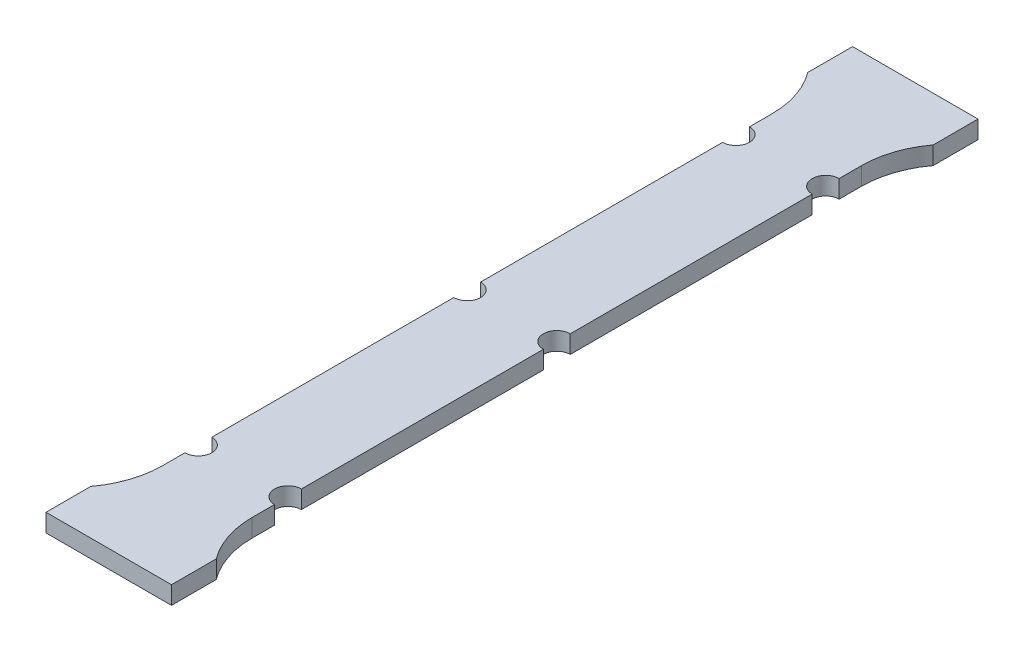
ISO-10303-21;
HEADER;
FILE_DESCRIPTION(('STEP AP214'),'2;1');
FILE_NAME('part.step','',(''),(''),'','','');
FILE_SCHEMA(('AUTOMOTIVE_DESIGN { 1 0 10303 214 1 1 1 1 }'));
ENDSEC;
DATA;
#1=APPLICATION_CONTEXT('core data for automotive mechanical design processes');
#2=APPLICATION_PROTOCOL_DEFINITION('international standard','automotive_design',2000,#1);
#3=PRODUCT_CONTEXT('',#1,'mechanical');
#4=PRODUCT('Part','Part','',(#3));
#5=PRODUCT_RELATED_PRODUCT_CATEGORY('part','',(#4));
#6=PRODUCT_DEFINITION_FORMATION('','',#4);
#7=PRODUCT_DEFINITION_CONTEXT('part definition',#1,'design');
#8=PRODUCT_DEFINITION('design','',#6,#7);
#9=PRODUCT_DEFINITION_SHAPE('','',#8);
#10=(LENGTH_UNIT() NAMED_UNIT(*) SI_UNIT(.MILLI.,.METRE.));
#11=(NAMED_UNIT(*) PLANE_ANGLE_UNIT() SI_UNIT($,.RADIAN.));
#12=(NAMED_UNIT(*) SI_UNIT($,.STERADIAN.) SOLID_ANGLE_UNIT());
#13=UNCERTAINTY_MEASURE_WITH_UNIT(LENGTH_MEASURE(1.E-05),#10,'distance_accuracy_value','');
#14=(GEOMETRIC_REPRESENTATION_CONTEXT(3) GLOBAL_UNCERTAINTY_ASSIGNED_CONTEXT((#13)) GLOBAL_UNIT_ASSIGNED_CONTEXT((#10,
#11,#12)) REPRESENTATION_CONTEXT('',''));
#15=CARTESIAN_POINT('',(0.,0.,0.));
#16=DIRECTION('',(0.,0.,1.));
#17=DIRECTION('',(1.,0.,0.));
#18=AXIS2_PLACEMENT_3D('',#15,#16,#17);
#19=CARTESIAN_POINT('',(0.,2.,45.0000000000001));
#20=DIRECTION('',(0.,-1.,0.));
#21=DIRECTION('',(0.,0.,-1.));
#22=AXIS2_PLACEMENT_3D('',#19,#20,#21);
#23=CYLINDRICAL_SURFACE('',#22,1.5);
#24=CARTESIAN_POINT('',(0.,0.,45.0000000000001));
#25=DIRECTION('',(0.,1.,0.));
#26=DIRECTION('',(0.,0.,1.));
#27=AXIS2_PLACEMENT_3D('',#24,#25,#26);
#28=CIRCLE('',#27,1.5);
#29=CARTESIAN_POINT('',(0.,0.,46.5000000000001));
#30=VERTEX_POINT('',#29);
#31=CARTESIAN_POINT('',(0.,0.,43.5000000000001));
#32=VERTEX_POINT('',#31);
#33=EDGE_CURVE('E207',#30,#32,#28,.T.);
#34=ORIENTED_EDGE('',*,*,#33,.F.);
#35=DIRECTION('',(0.,-1.,0.));
#36=VECTOR('',#35,1.);
#37=CARTESIAN_POINT('',(0.,2.,46.5000000000001));
#38=LINE('',#37,#36);
#39=CARTESIAN_POINT('',(0.,2.,46.5000000000001));
#40=VERTEX_POINT('',#39);
#41=EDGE_CURVE('E202',#40,#30,#38,.T.);
#42=ORIENTED_EDGE('',*,*,#41,.F.);
#43=CARTESIAN_POINT('',(0.,2.,45.0000000000001));
#44=DIRECTION('',(0.,1.,0.));
#45=DIRECTION('',(0.,0.,1.));
#46=AXIS2_PLACEMENT_3D('',#43,#44,#45);
#47=CIRCLE('',#46,1.5);
#48=CARTESIAN_POINT('',(0.,2.,43.5000000000001));
#49=VERTEX_POINT('',#48);
#50=EDGE_CURVE('E205',#40,#49,#47,.T.);
#51=ORIENTED_EDGE('',*,*,#50,.T.);
#52=DIRECTION('',(0.,-1.,0.));
#53=VECTOR('',#52,1.);
#54=CARTESIAN_POINT('',(0.,2.,43.5000000000001));
#55=LINE('',#54,#53);
#56=EDGE_CURVE('E310',#49,#32,#55,.T.);
#57=ORIENTED_EDGE('',*,*,#56,.T.);
#58=EDGE_LOOP('',(#34,#42,#51,#57));
#59=FACE_BOUND('',#58,.T.);
#60=ADVANCED_FACE('F41',(#59),#23,.F.);
#61=CARTESIAN_POINT('',(0.,2.,0.));
#62=DIRECTION('',(1.,0.,0.));
#63=DIRECTION('',(0.,0.,-1.));
#64=AXIS2_PLACEMENT_3D('',#61,#62,#63);
#65=PLANE('',#64);
#66=DIRECTION('',(0.,0.,1.));
#67=VECTOR('',#66,1.);
#68=CARTESIAN_POINT('',(0.,0.,0.));
#69=LINE('',#68,#67);
#70=CARTESIAN_POINT('',(0.,0.,73.5000000000001));
#71=VERTEX_POINT('',#70);
#72=EDGE_CURVE('E271',#30,#71,#69,.T.);
#73=ORIENTED_EDGE('',*,*,#72,.T.);
#74=DIRECTION('',(0.,-1.,0.));
#75=VECTOR('',#74,1.);
#76=CARTESIAN_POINT('',(0.,2.,73.5000000000001));
#77=LINE('',#76,#75);
#78=CARTESIAN_POINT('',(0.,2.,73.5000000000001));
#79=VERTEX_POINT('',#78);
#80=EDGE_CURVE('E212',#79,#71,#77,.T.);
#81=ORIENTED_EDGE('',*,*,#80,.F.);
#82=DIRECTION('',(0.,0.,1.));
#83=VECTOR('',#82,1.);
#84=CARTESIAN_POINT('',(0.,2.,0.));
#85=LINE('',#84,#83);
#86=EDGE_CURVE('E215',#40,#79,#85,.T.);
#87=ORIENTED_EDGE('',*,*,#86,.F.);
#88=ORIENTED_EDGE('',*,*,#41,.T.);
#89=EDGE_LOOP('',(#73,#81,#87,#88));
#90=FACE_BOUND('',#89,.T.);
#91=ADVANCED_FACE('F216',(#90),#65,.F.);
#92=CARTESIAN_POINT('',(3.3133218391157E-13,2.,75.0000000000001));
#93=DIRECTION('',(0.,-1.,0.));
#94=DIRECTION('',(0.,0.,-1.));
#95=AXIS2_PLACEMENT_3D('',#92,#93,#94);
#96=CYLINDRICAL_SURFACE('',#95,1.5);
#97=CARTESIAN_POINT('',(3.3133218391157E-13,0.,75.0000000000001));
#98=DIRECTION('',(0.,1.,0.));
#99=DIRECTION('',(0.,0.,1.));
#100=AXIS2_PLACEMENT_3D('',#97,#98,#99);
#101=CIRCLE('',#100,1.5);
#102=CARTESIAN_POINT('',(0.,0.,76.5000000000001));
#103=VERTEX_POINT('',#102);
#104=EDGE_CURVE('E273',#103,#71,#101,.T.);
#105=ORIENTED_EDGE('',*,*,#104,.F.);
#106=DIRECTION('',(0.,-1.,0.));
#107=VECTOR('',#106,1.);
#108=CARTESIAN_POINT('',(0.,2.,76.5000000000001));
#109=LINE('',#108,#107);
#110=CARTESIAN_POINT('',(0.,2.,76.5000000000001));
#111=VERTEX_POINT('',#110);
#112=EDGE_CURVE('E352',#111,#103,#109,.T.);
#113=ORIENTED_EDGE('',*,*,#112,.F.);
#114=CARTESIAN_POINT('',(3.3133218391157E-13,2.,75.0000000000001));
#115=DIRECTION('',(0.,1.,0.));
#116=DIRECTION('',(0.,0.,1.));
#117=AXIS2_PLACEMENT_3D('',#114,#115,#116);
#118=CIRCLE('',#117,1.5);
#119=EDGE_CURVE('E220',#111,#79,#118,.T.);
#120=ORIENTED_EDGE('',*,*,#119,.T.);
#121=ORIENTED_EDGE('',*,*,#80,.T.);
#122=EDGE_LOOP('',(#105,#113,#120,#121));
#123=FACE_BOUND('',#122,.T.);
#124=ADVANCED_FACE('F405',(#123),#96,.F.);
#125=CARTESIAN_POINT('',(0.,0.,79.0000000000007));
#126=VERTEX_POINT('',#125);
#127=EDGE_CURVE('E274',#103,#126,#69,.T.);
#128=ORIENTED_EDGE('',*,*,#127,.T.);
#129=DIRECTION('',(0.,1.,0.));
#130=VECTOR('',#129,1.);
#131=CARTESIAN_POINT('',(0.,2.,79.0000000000007));
#132=LINE('',#131,#130);
#133=CARTESIAN_POINT('',(0.,2.,79.0000000000007));
#134=VERTEX_POINT('',#133);
#135=EDGE_CURVE('E56',#126,#134,#132,.T.);
#136=ORIENTED_EDGE('',*,*,#135,.T.);
#137=EDGE_CURVE('E222',#111,#134,#85,.T.);
#138=ORIENTED_EDGE('',*,*,#137,.F.);
#139=ORIENTED_EDGE('',*,*,#112,.T.);
#140=EDGE_LOOP('',(#128,#136,#138,#139));
#141=FACE_BOUND('',#140,.T.);
#142=ADVANCED_FACE('F402',(#141),#65,.F.);
#143=CARTESIAN_POINT('',(-1.9999999999995,2.,0.));
#144=DIRECTION('',(-1.,0.,0.));
#145=DIRECTION('',(0.,0.,1.));
#146=AXIS2_PLACEMENT_3D('',#143,#144,#145);
#147=PLANE('',#146);
#148=DIRECTION('',(0.,0.,-1.));
#149=VECTOR('',#148,1.);
#150=CARTESIAN_POINT('',(-1.9999999999995,0.,0.));
#151=LINE('',#150,#149);
#152=CARTESIAN_POINT('',(-1.9999999999995,0.,90.));
#153=VERTEX_POINT('',#152);
#154=CARTESIAN_POINT('',(-1.9999999999995,0.,85.));
#155=VERTEX_POINT('',#154);
#156=EDGE_CURVE('E277',#153,#155,#151,.T.);
#157=ORIENTED_EDGE('',*,*,#156,.F.);
#158=DIRECTION('',(0.,-1.,0.));
#159=VECTOR('',#158,1.);
#160=CARTESIAN_POINT('',(-1.9999999999995,2.,90.));
#161=LINE('',#160,#159);
#162=CARTESIAN_POINT('',(-1.9999999999995,2.,90.));
#163=VERTEX_POINT('',#162);
#164=EDGE_CURVE('E347',#163,#153,#161,.T.);
#165=ORIENTED_EDGE('',*,*,#164,.F.);
#166=DIRECTION('',(0.,0.,-1.));
#167=VECTOR('',#166,1.);
#168=CARTESIAN_POINT('',(-1.9999999999995,2.,0.));
#169=LINE('',#168,#167);
#170=CARTESIAN_POINT('',(-1.9999999999995,2.,85.));
#171=VERTEX_POINT('',#170);
#172=EDGE_CURVE('E236',#163,#171,#169,.T.);
#173=ORIENTED_EDGE('',*,*,#172,.T.);
#174=DIRECTION('',(0.,-1.,0.));
#175=VECTOR('',#174,1.);
#176=CARTESIAN_POINT('',(-1.9999999999995,2.,85.));
#177=LINE('',#176,#175);
#178=EDGE_CURVE('E349',#171,#155,#177,.T.);
#179=ORIENTED_EDGE('',*,*,#178,.T.);
#180=EDGE_LOOP('',(#157,#165,#173,#179));
#181=FACE_BOUND('',#180,.T.);
#182=ADVANCED_FACE('F398',(#181),#147,.T.);
#183=CARTESIAN_POINT('',(0.,2.,90.));
#184=DIRECTION('',(0.,0.,-1.));
#185=DIRECTION('',(-1.,0.,0.));
#186=AXIS2_PLACEMENT_3D('',#183,#184,#185);
#187=PLANE('',#186);
#188=DIRECTION('',(1.,0.,0.));
#189=VECTOR('',#188,1.);
#190=CARTESIAN_POINT('',(0.,0.,90.));
#191=LINE('',#190,#189);
#192=CARTESIAN_POINT('',(12.0000000000005,0.,90.));
#193=VERTEX_POINT('',#192);
#194=EDGE_CURVE('E279',#153,#193,#191,.T.);
#195=ORIENTED_EDGE('',*,*,#194,.T.);
#196=DIRECTION('',(0.,-1.,0.));
#197=VECTOR('',#196,1.);
#198=CARTESIAN_POINT('',(12.0000000000005,2.,90.));
#199=LINE('',#198,#197);
#200=CARTESIAN_POINT('',(12.0000000000005,2.,90.));
#201=VERTEX_POINT('',#200);
#202=EDGE_CURVE('E344',#201,#193,#199,.T.);
#203=ORIENTED_EDGE('',*,*,#202,.F.);
#204=DIRECTION('',(1.,0.,0.));
#205=VECTOR('',#204,1.);
#206=CARTESIAN_POINT('',(0.,2.,90.));
#207=LINE('',#206,#205);
#208=EDGE_CURVE('E239',#163,#201,#207,.T.);
#209=ORIENTED_EDGE('',*,*,#208,.F.);
#210=ORIENTED_EDGE('',*,*,#164,.T.);
#211=EDGE_LOOP('',(#195,#203,#209,#210));
#212=FACE_BOUND('',#211,.T.);
#213=ADVANCED_FACE('F394',(#212),#187,.F.);
#214=CARTESIAN_POINT('',(12.0000000000005,2.,0.));
#215=DIRECTION('',(-1.,0.,0.));
#216=DIRECTION('',(0.,0.,1.));
#217=AXIS2_PLACEMENT_3D('',#214,#215,#216);
#218=PLANE('',#217);
#219=DIRECTION('',(0.,0.,-1.));
#220=VECTOR('',#219,1.);
#221=CARTESIAN_POINT('',(12.0000000000005,0.,0.));
#222=LINE('',#221,#220);
#223=CARTESIAN_POINT('',(12.0000000000005,0.,85.));
#224=VERTEX_POINT('',#223);
#225=EDGE_CURVE('E281',#193,#224,#222,.T.);
#226=ORIENTED_EDGE('',*,*,#225,.T.);
#227=DIRECTION('',(0.,-1.,0.));
#228=VECTOR('',#227,1.);
#229=CARTESIAN_POINT('',(12.0000000000005,2.,85.));
#230=LINE('',#229,#228);
#231=CARTESIAN_POINT('',(12.0000000000005,2.,85.));
#232=VERTEX_POINT('',#231);
#233=EDGE_CURVE('E341',#232,#224,#230,.T.);
#234=ORIENTED_EDGE('',*,*,#233,.F.);
#235=DIRECTION('',(0.,0.,-1.));
#236=VECTOR('',#235,1.);
#237=CARTESIAN_POINT('',(12.0000000000005,2.,0.));
#238=LINE('',#237,#236);
#239=EDGE_CURVE('E241',#201,#232,#238,.T.);
#240=ORIENTED_EDGE('',*,*,#239,.F.);
#241=ORIENTED_EDGE('',*,*,#202,.T.);
#242=EDGE_LOOP('',(#226,#234,#240,#241));
#243=FACE_BOUND('',#242,.T.);
#244=ADVANCED_FACE('F390',(#243),#218,.F.);
#245=CARTESIAN_POINT('',(10.,2.,0.));
#246=DIRECTION('',(-1.,0.,0.));
#247=DIRECTION('',(0.,0.,1.));
#248=AXIS2_PLACEMENT_3D('',#245,#246,#247);
#249=PLANE('',#248);
#250=DIRECTION('',(0.,0.,-1.));
#251=VECTOR('',#250,1.);
#252=CARTESIAN_POINT('',(10.,2.,0.));
#253=LINE('',#252,#251);
#254=CARTESIAN_POINT('',(10.,2.,78.9999999999993));
#255=VERTEX_POINT('',#254);
#256=CARTESIAN_POINT('',(10.,2.,76.5));
#257=VERTEX_POINT('',#256);
#258=EDGE_CURVE('E243',#255,#257,#253,.T.);
#259=ORIENTED_EDGE('',*,*,#258,.F.);
#260=DIRECTION('',(0.,-1.,0.));
#261=VECTOR('',#260,1.);
#262=CARTESIAN_POINT('',(10.,2.,78.9999999999993));
#263=LINE('',#262,#261);
#264=CARTESIAN_POINT('',(10.,0.,78.9999999999993));
#265=VERTEX_POINT('',#264);
#266=EDGE_CURVE('E359',#255,#265,#263,.T.);
#267=ORIENTED_EDGE('',*,*,#266,.T.);
#268=DIRECTION('',(0.,0.,-1.));
#269=VECTOR('',#268,1.);
#270=CARTESIAN_POINT('',(10.,0.,0.));
#271=LINE('',#270,#269);
#272=CARTESIAN_POINT('',(10.,0.,76.5));
#273=VERTEX_POINT('',#272);
#274=EDGE_CURVE('E284',#265,#273,#271,.T.);
#275=ORIENTED_EDGE('',*,*,#274,.T.);
#276=DIRECTION('',(0.,-1.,0.));
#277=VECTOR('',#276,1.);
#278=CARTESIAN_POINT('',(10.,2.,76.5));
#279=LINE('',#278,#277);
#280=EDGE_CURVE('E338',#257,#273,#279,.T.);
#281=ORIENTED_EDGE('',*,*,#280,.F.);
#282=EDGE_LOOP('',(#259,#267,#275,#281));
#283=FACE_BOUND('',#282,.T.);
#284=ADVANCED_FACE('F383',(#283),#249,.F.);
#285=CARTESIAN_POINT('',(10.0000000000003,2.,75.));
#286=DIRECTION('',(0.,-1.,0.));
#287=DIRECTION('',(0.,0.,-1.));
#288=AXIS2_PLACEMENT_3D('',#285,#286,#287);
#289=CYLINDRICAL_SURFACE('',#288,1.5);
#290=CARTESIAN_POINT('',(10.0000000000003,0.,75.));
#291=DIRECTION('',(0.,1.,0.));
#292=DIRECTION('',(0.,0.,1.));
#293=AXIS2_PLACEMENT_3D('',#290,#291,#292);
#294=CIRCLE('',#293,1.5);
#295=CARTESIAN_POINT('',(10.,0.,73.5));
#296=VERTEX_POINT('',#295);
#297=EDGE_CURVE('E286',#296,#273,#294,.T.);
#298=ORIENTED_EDGE('',*,*,#297,.F.);
#299=DIRECTION('',(0.,-1.,0.));
#300=VECTOR('',#299,1.);
#301=CARTESIAN_POINT('',(10.,2.,73.5));
#302=LINE('',#301,#300);
#303=CARTESIAN_POINT('',(10.,2.,73.5));
#304=VERTEX_POINT('',#303);
#305=EDGE_CURVE('E336',#304,#296,#302,.T.);
#306=ORIENTED_EDGE('',*,*,#305,.F.);
#307=CARTESIAN_POINT('',(10.0000000000003,2.,75.));
#308=DIRECTION('',(0.,1.,0.));
#309=DIRECTION('',(0.,0.,1.));
#310=AXIS2_PLACEMENT_3D('',#307,#308,#309);
#311=CIRCLE('',#310,1.5);
#312=EDGE_CURVE('E245',#304,#257,#311,.T.);
#313=ORIENTED_EDGE('',*,*,#312,.T.);
#314=ORIENTED_EDGE('',*,*,#280,.T.);
#315=EDGE_LOOP('',(#298,#306,#313,#314));
#316=FACE_BOUND('',#315,.T.);
#317=ADVANCED_FACE('F465',(#316),#289,.F.);
#318=CARTESIAN_POINT('',(10.,0.,46.5));
#319=VERTEX_POINT('',#318);
#320=EDGE_CURVE('E287',#296,#319,#271,.T.);
#321=ORIENTED_EDGE('',*,*,#320,.T.);
#322=DIRECTION('',(0.,-1.,0.));
#323=VECTOR('',#322,1.);
#324=CARTESIAN_POINT('',(10.,2.,46.5));
#325=LINE('',#324,#323);
#326=CARTESIAN_POINT('',(10.,2.,46.5));
#327=VERTEX_POINT('',#326);
#328=EDGE_CURVE('E334',#327,#319,#325,.T.);
#329=ORIENTED_EDGE('',*,*,#328,.F.);
#330=EDGE_CURVE('E246',#304,#327,#253,.T.);
#331=ORIENTED_EDGE('',*,*,#330,.F.);
#332=ORIENTED_EDGE('',*,*,#305,.T.);
#333=EDGE_LOOP('',(#321,#329,#331,#332));
#334=FACE_BOUND('',#333,.T.);
#335=ADVANCED_FACE('F462',(#334),#249,.F.);
#336=CARTESIAN_POINT('',(10.,2.,45.));
#337=DIRECTION('',(0.,-1.,0.));
#338=DIRECTION('',(0.,0.,-1.));
#339=AXIS2_PLACEMENT_3D('',#336,#337,#338);
#340=CYLINDRICAL_SURFACE('',#339,1.5);
#341=CARTESIAN_POINT('',(10.,0.,45.));
#342=DIRECTION('',(0.,1.,0.));
#343=DIRECTION('',(0.,0.,1.));
#344=AXIS2_PLACEMENT_3D('',#341,#342,#343);
#345=CIRCLE('',#344,1.5);
#346=CARTESIAN_POINT('',(10.,0.,43.5));
#347=VERTEX_POINT('',#346);
#348=EDGE_CURVE('E290',#347,#319,#345,.T.);
#349=ORIENTED_EDGE('',*,*,#348,.F.);
#350=DIRECTION('',(0.,-1.,0.));
#351=VECTOR('',#350,1.);
#352=CARTESIAN_POINT('',(10.,2.,43.5));
#353=LINE('',#352,#351);
#354=CARTESIAN_POINT('',(10.,2.,43.5));
#355=VERTEX_POINT('',#354);
#356=EDGE_CURVE('E332',#355,#347,#353,.T.);
#357=ORIENTED_EDGE('',*,*,#356,.F.);
#358=CARTESIAN_POINT('',(10.,2.,45.));
#359=DIRECTION('',(0.,1.,0.));
#360=DIRECTION('',(0.,0.,1.));
#361=AXIS2_PLACEMENT_3D('',#358,#359,#360);
#362=CIRCLE('',#361,1.5);
#363=EDGE_CURVE('E249',#355,#327,#362,.T.);
#364=ORIENTED_EDGE('',*,*,#363,.T.);
#365=ORIENTED_EDGE('',*,*,#328,.T.);
#366=EDGE_LOOP('',(#349,#357,#364,#365));
#367=FACE_BOUND('',#366,.T.);
#368=ADVANCED_FACE('F455',(#367),#340,.F.);
#369=CARTESIAN_POINT('',(10.,2.,0.));
#370=DIRECTION('',(-1.,0.,0.));
#371=DIRECTION('',(0.,0.,1.));
#372=AXIS2_PLACEMENT_3D('',#369,#370,#371);
#373=PLANE('',#372);
#374=DIRECTION('',(0.,0.,-1.));
#375=VECTOR('',#374,1.);
#376=CARTESIAN_POINT('',(10.,0.,0.));
#377=LINE('',#376,#375);
#378=CARTESIAN_POINT('',(10.,0.,16.5));
#379=VERTEX_POINT('',#378);
#380=EDGE_CURVE('E293',#347,#379,#377,.T.);
#381=ORIENTED_EDGE('',*,*,#380,.T.);
#382=DIRECTION('',(0.,-1.,0.));
#383=VECTOR('',#382,1.);
#384=CARTESIAN_POINT('',(10.,2.,16.5));
#385=LINE('',#384,#383);
#386=CARTESIAN_POINT('',(10.,2.,16.5));
#387=VERTEX_POINT('',#386);
#388=EDGE_CURVE('E330',#387,#379,#385,.T.);
#389=ORIENTED_EDGE('',*,*,#388,.F.);
#390=DIRECTION('',(0.,0.,-1.));
#391=VECTOR('',#390,1.);
#392=CARTESIAN_POINT('',(10.,2.,0.));
#393=LINE('',#392,#391);
#394=EDGE_CURVE('E252',#355,#387,#393,.T.);
#395=ORIENTED_EDGE('',*,*,#394,.F.);
#396=ORIENTED_EDGE('',*,*,#356,.T.);
#397=EDGE_LOOP('',(#381,#389,#395,#396));
#398=FACE_BOUND('',#397,.T.);
#399=ADVANCED_FACE('F466',(#398),#373,.F.);
#400=CARTESIAN_POINT('',(10.,2.,15.));
#401=DIRECTION('',(0.,-1.,0.));
#402=DIRECTION('',(0.,0.,-1.));
#403=AXIS2_PLACEMENT_3D('',#400,#401,#402);
#404=CYLINDRICAL_SURFACE('',#403,1.5);
#405=CARTESIAN_POINT('',(10.,0.,15.));
#406=DIRECTION('',(0.,1.,0.));
#407=DIRECTION('',(0.,0.,1.));
#408=AXIS2_PLACEMENT_3D('',#405,#406,#407);
#409=CIRCLE('',#408,1.5);
#410=CARTESIAN_POINT('',(10.,0.,13.5));
#411=VERTEX_POINT('',#410);
#412=EDGE_CURVE('E296',#411,#379,#409,.T.);
#413=ORIENTED_EDGE('',*,*,#412,.F.);
#414=DIRECTION('',(0.,-1.,0.));
#415=VECTOR('',#414,1.);
#416=CARTESIAN_POINT('',(10.,2.,13.5));
#417=LINE('',#416,#415);
#418=CARTESIAN_POINT('',(10.,2.,13.5));
#419=VERTEX_POINT('',#418);
#420=EDGE_CURVE('E328',#419,#411,#417,.T.);
#421=ORIENTED_EDGE('',*,*,#420,.F.);
#422=CARTESIAN_POINT('',(10.,2.,15.));
#423=DIRECTION('',(0.,1.,0.));
#424=DIRECTION('',(0.,0.,1.));
#425=AXIS2_PLACEMENT_3D('',#422,#423,#424);
#426=CIRCLE('',#425,1.5);
#427=EDGE_CURVE('E254',#419,#387,#426,.T.);
#428=ORIENTED_EDGE('',*,*,#427,.T.);
#429=ORIENTED_EDGE('',*,*,#388,.T.);
#430=EDGE_LOOP('',(#413,#421,#428,#429));
#431=FACE_BOUND('',#430,.T.);
#432=ADVANCED_FACE('F448',(#431),#404,.F.);
#433=CARTESIAN_POINT('',(10.,0.,11.));
#434=VERTEX_POINT('',#433);
#435=EDGE_CURVE('E297',#411,#434,#377,.T.);
#436=ORIENTED_EDGE('',*,*,#435,.T.);
#437=DIRECTION('',(0.,1.,0.));
#438=VECTOR('',#437,1.);
#439=CARTESIAN_POINT('',(10.,2.,11.));
#440=LINE('',#439,#438);
#441=CARTESIAN_POINT('',(10.,2.,11.));
#442=VERTEX_POINT('',#441);
#443=EDGE_CURVE('E357',#434,#442,#440,.T.);
#444=ORIENTED_EDGE('',*,*,#443,.T.);
#445=EDGE_CURVE('E255',#419,#442,#393,.T.);
#446=ORIENTED_EDGE('',*,*,#445,.F.);
#447=ORIENTED_EDGE('',*,*,#420,.T.);
#448=EDGE_LOOP('',(#436,#444,#446,#447));
#449=FACE_BOUND('',#448,.T.);
#450=ADVANCED_FACE('F443',(#449),#373,.F.);
#451=CARTESIAN_POINT('',(12.,2.,0.));
#452=DIRECTION('',(1.,0.,0.));
#453=DIRECTION('',(0.,0.,-1.));
#454=AXIS2_PLACEMENT_3D('',#451,#452,#453);
#455=PLANE('',#454);
#456=DIRECTION('',(0.,0.,1.));
#457=VECTOR('',#456,1.);
#458=CARTESIAN_POINT('',(12.,0.,0.));
#459=LINE('',#458,#457);
#460=CARTESIAN_POINT('',(12.,0.,0.));
#461=VERTEX_POINT('',#460);
#462=CARTESIAN_POINT('',(12.,0.,5.));
#463=VERTEX_POINT('',#462);
#464=EDGE_CURVE('E300',#461,#463,#459,.T.);
#465=ORIENTED_EDGE('',*,*,#464,.F.);
#466=DIRECTION('',(0.,-1.,0.));
#467=VECTOR('',#466,1.);
#468=CARTESIAN_POINT('',(12.,2.,0.));
#469=LINE('',#468,#467);
#470=CARTESIAN_POINT('',(12.,2.,0.));
#471=VERTEX_POINT('',#470);
#472=EDGE_CURVE('E323',#471,#461,#469,.T.);
#473=ORIENTED_EDGE('',*,*,#472,.F.);
#474=DIRECTION('',(0.,0.,1.));
#475=VECTOR('',#474,1.);
#476=CARTESIAN_POINT('',(12.,2.,0.));
#477=LINE('',#476,#475);
#478=CARTESIAN_POINT('',(12.,2.,5.));
#479=VERTEX_POINT('',#478);
#480=EDGE_CURVE('E258',#471,#479,#477,.T.);
#481=ORIENTED_EDGE('',*,*,#480,.T.);
#482=DIRECTION('',(0.,-1.,0.));
#483=VECTOR('',#482,1.);
#484=CARTESIAN_POINT('',(12.,2.,5.));
#485=LINE('',#484,#483);
#486=EDGE_CURVE('E325',#479,#463,#485,.T.);
#487=ORIENTED_EDGE('',*,*,#486,.T.);
#488=EDGE_LOOP('',(#465,#473,#481,#487));
#489=FACE_BOUND('',#488,.T.);
#490=ADVANCED_FACE('F433',(#489),#455,.T.);
#491=CARTESIAN_POINT('',(0.,2.,0.));
#492=DIRECTION('',(0.,0.,1.));
#493=DIRECTION('',(1.,0.,0.));
#494=AXIS2_PLACEMENT_3D('',#491,#492,#493);
#495=PLANE('',#494);
#496=DIRECTION('',(-1.,0.,0.));
#497=VECTOR('',#496,1.);
#498=CARTESIAN_POINT('',(0.,0.,0.));
#499=LINE('',#498,#497);
#500=CARTESIAN_POINT('',(-2.,0.,0.));
#501=VERTEX_POINT('',#500);
#502=EDGE_CURVE('E303',#461,#501,#499,.T.);
#503=ORIENTED_EDGE('',*,*,#502,.T.);
#504=DIRECTION('',(0.,-1.,0.));
#505=VECTOR('',#504,1.);
#506=CARTESIAN_POINT('',(-2.,2.,0.));
#507=LINE('',#506,#505);
#508=CARTESIAN_POINT('',(-2.,2.,0.));
#509=VERTEX_POINT('',#508);
#510=EDGE_CURVE('E320',#509,#501,#507,.T.);
#511=ORIENTED_EDGE('',*,*,#510,.F.);
#512=DIRECTION('',(-1.,0.,0.));
#513=VECTOR('',#512,1.);
#514=CARTESIAN_POINT('',(0.,2.,0.));
#515=LINE('',#514,#513);
#516=EDGE_CURVE('E261',#471,#509,#515,.T.);
#517=ORIENTED_EDGE('',*,*,#516,.F.);
#518=ORIENTED_EDGE('',*,*,#472,.T.);
#519=EDGE_LOOP('',(#503,#511,#517,#518));
#520=FACE_BOUND('',#519,.T.);
#521=ADVANCED_FACE('F430',(#520),#495,.F.);
#522=CARTESIAN_POINT('',(-2.,2.,0.));
#523=DIRECTION('',(1.,0.,0.));
#524=DIRECTION('',(0.,0.,-1.));
#525=AXIS2_PLACEMENT_3D('',#522,#523,#524);
#526=PLANE('',#525);
#527=DIRECTION('',(0.,0.,1.));
#528=VECTOR('',#527,1.);
#529=CARTESIAN_POINT('',(-2.,0.,0.));
#530=LINE('',#529,#528);
#531=CARTESIAN_POINT('',(-2.,0.,5.));
#532=VERTEX_POINT('',#531);
#533=EDGE_CURVE('E305',#501,#532,#530,.T.);
#534=ORIENTED_EDGE('',*,*,#533,.T.);
#535=DIRECTION('',(0.,-1.,0.));
#536=VECTOR('',#535,1.);
#537=CARTESIAN_POINT('',(-2.,2.,5.));
#538=LINE('',#537,#536);
#539=CARTESIAN_POINT('',(-2.,2.,5.));
#540=VERTEX_POINT('',#539);
#541=EDGE_CURVE('E317',#540,#532,#538,.T.);
#542=ORIENTED_EDGE('',*,*,#541,.F.);
#543=DIRECTION('',(0.,0.,1.));
#544=VECTOR('',#543,1.);
#545=CARTESIAN_POINT('',(-2.,2.,0.));
#546=LINE('',#545,#544);
#547=EDGE_CURVE('E263',#509,#540,#546,.T.);
#548=ORIENTED_EDGE('',*,*,#547,.F.);
#549=ORIENTED_EDGE('',*,*,#510,.T.);
#550=EDGE_LOOP('',(#534,#542,#548,#549));
#551=FACE_BOUND('',#550,.T.);
#552=ADVANCED_FACE('F422',(#551),#526,.F.);
#553=CARTESIAN_POINT('',(0.,2.,0.));
#554=DIRECTION('',(1.,0.,0.));
#555=DIRECTION('',(0.,0.,-1.));
#556=AXIS2_PLACEMENT_3D('',#553,#554,#555);
#557=PLANE('',#556);
#558=DIRECTION('',(0.,0.,1.));
#559=VECTOR('',#558,1.);
#560=CARTESIAN_POINT('',(0.,2.,0.));
#561=LINE('',#560,#559);
#562=CARTESIAN_POINT('',(0.,2.,11.));
#563=VERTEX_POINT('',#562);
#564=CARTESIAN_POINT('',(0.,2.,13.5));
#565=VERTEX_POINT('',#564);
#566=EDGE_CURVE('E265',#563,#565,#561,.T.);
#567=ORIENTED_EDGE('',*,*,#566,.F.);
#568=DIRECTION('',(0.,-1.,0.));
#569=VECTOR('',#568,1.);
#570=CARTESIAN_POINT('',(0.,2.,11.));
#571=LINE('',#570,#569);
#572=CARTESIAN_POINT('',(0.,0.,11.));
#573=VERTEX_POINT('',#572);
#574=EDGE_CURVE('E211',#563,#573,#571,.T.);
#575=ORIENTED_EDGE('',*,*,#574,.T.);
#576=DIRECTION('',(0.,0.,1.));
#577=VECTOR('',#576,1.);
#578=CARTESIAN_POINT('',(0.,0.,0.));
#579=LINE('',#578,#577);
#580=CARTESIAN_POINT('',(0.,0.,13.5));
#581=VERTEX_POINT('',#580);
#582=EDGE_CURVE('E233',#573,#581,#579,.T.);
#583=ORIENTED_EDGE('',*,*,#582,.T.);
#584=DIRECTION('',(0.,-1.,0.));
#585=VECTOR('',#584,1.);
#586=CARTESIAN_POINT('',(0.,2.,13.5));
#587=LINE('',#586,#585);
#588=EDGE_CURVE('E314',#565,#581,#587,.T.);
#589=ORIENTED_EDGE('',*,*,#588,.F.);
#590=EDGE_LOOP('',(#567,#575,#583,#589));
#591=FACE_BOUND('',#590,.T.);
#592=ADVANCED_FACE('F415',(#591),#557,.F.);
#593=CARTESIAN_POINT('',(0.,2.,15.));
#594=DIRECTION('',(0.,-1.,0.));
#595=DIRECTION('',(0.,0.,-1.));
#596=AXIS2_PLACEMENT_3D('',#593,#594,#595);
#597=CYLINDRICAL_SURFACE('',#596,1.5);
#598=CARTESIAN_POINT('',(0.,0.,15.));
#599=DIRECTION('',(0.,1.,0.));
#600=DIRECTION('',(0.,0.,1.));
#601=AXIS2_PLACEMENT_3D('',#598,#599,#600);
#602=CIRCLE('',#601,1.5);
#603=CARTESIAN_POINT('',(0.,0.,16.5));
#604=VERTEX_POINT('',#603);
#605=EDGE_CURVE('E231',#604,#581,#602,.T.);
#606=ORIENTED_EDGE('',*,*,#605,.F.);
#607=DIRECTION('',(0.,-1.,0.));
#608=VECTOR('',#607,1.);
#609=CARTESIAN_POINT('',(0.,2.,16.5));
#610=LINE('',#609,#608);
#611=CARTESIAN_POINT('',(0.,2.,16.5));
#612=VERTEX_POINT('',#611);
#613=EDGE_CURVE('E312',#612,#604,#610,.T.);
#614=ORIENTED_EDGE('',*,*,#613,.F.);
#615=CARTESIAN_POINT('',(0.,2.,15.));
#616=DIRECTION('',(0.,1.,0.));
#617=DIRECTION('',(0.,0.,1.));
#618=AXIS2_PLACEMENT_3D('',#615,#616,#617);
#619=CIRCLE('',#618,1.5);
#620=EDGE_CURVE('E267',#612,#565,#619,.T.);
#621=ORIENTED_EDGE('',*,*,#620,.T.);
#622=ORIENTED_EDGE('',*,*,#588,.T.);
#623=EDGE_LOOP('',(#606,#614,#621,#622));
#624=FACE_BOUND('',#623,.T.);
#625=ADVANCED_FACE('F411',(#624),#597,.F.);
#626=EDGE_CURVE('E228',#604,#32,#579,.T.);
#627=ORIENTED_EDGE('',*,*,#626,.T.);
#628=ORIENTED_EDGE('',*,*,#56,.F.);
#629=EDGE_CURVE('E226',#612,#49,#561,.T.);
#630=ORIENTED_EDGE('',*,*,#629,.F.);
#631=ORIENTED_EDGE('',*,*,#613,.T.);
#632=EDGE_LOOP('',(#627,#628,#630,#631));
#633=FACE_BOUND('',#632,.T.);
#634=ADVANCED_FACE('F532',(#633),#557,.F.);
#635=CARTESIAN_POINT('',(0.,2.,0.));
#636=DIRECTION('',(0.,1.,0.));
#637=DIRECTION('',(0.,0.,1.));
#638=AXIS2_PLACEMENT_3D('',#635,#636,#637);
#639=PLANE('',#638);
#640=ORIENTED_EDGE('',*,*,#50,.F.);
#641=ORIENTED_EDGE('',*,*,#86,.T.);
#642=ORIENTED_EDGE('',*,*,#119,.F.);
#643=ORIENTED_EDGE('',*,*,#137,.T.);
#644=CARTESIAN_POINT('',(-10.,2.,79.0000000000007));
#645=DIRECTION('',(0.,1.,0.));
#646=DIRECTION('',(0.,0.,1.));
#647=AXIS2_PLACEMENT_3D('',#644,#645,#646);
#648=CIRCLE('',#647,10.);
#649=EDGE_CURVE('E11',#134,#171,#648,.F.);
#650=ORIENTED_EDGE('',*,*,#649,.T.);
#651=ORIENTED_EDGE('',*,*,#172,.F.);
#652=ORIENTED_EDGE('',*,*,#208,.T.);
#653=ORIENTED_EDGE('',*,*,#239,.T.);
#654=CARTESIAN_POINT('',(20.,2.,78.9999999999993));
#655=DIRECTION('',(0.,1.,0.));
#656=DIRECTION('',(0.,0.,1.));
#657=AXIS2_PLACEMENT_3D('',#654,#655,#656);
#658=CIRCLE('',#657,10.);
#659=EDGE_CURVE('E373',#232,#255,#658,.F.);
#660=ORIENTED_EDGE('',*,*,#659,.T.);
#661=ORIENTED_EDGE('',*,*,#258,.T.);
#662=ORIENTED_EDGE('',*,*,#312,.F.);
#663=ORIENTED_EDGE('',*,*,#330,.T.);
#664=ORIENTED_EDGE('',*,*,#363,.F.);
#665=ORIENTED_EDGE('',*,*,#394,.T.);
#666=ORIENTED_EDGE('',*,*,#427,.F.);
#667=ORIENTED_EDGE('',*,*,#445,.T.);
#668=CARTESIAN_POINT('',(20.,2.,11.));
#669=DIRECTION('',(0.,1.,0.));
#670=DIRECTION('',(0.,0.,1.));
#671=AXIS2_PLACEMENT_3D('',#668,#669,#670);
#672=CIRCLE('',#671,10.);
#673=EDGE_CURVE('E369',#442,#479,#672,.F.);
#674=ORIENTED_EDGE('',*,*,#673,.T.);
#675=ORIENTED_EDGE('',*,*,#480,.F.);
#676=ORIENTED_EDGE('',*,*,#516,.T.);
#677=ORIENTED_EDGE('',*,*,#547,.T.);
#678=CARTESIAN_POINT('',(-10.,2.,11.));
#679=DIRECTION('',(0.,1.,0.));
#680=DIRECTION('',(0.,0.,1.));
#681=AXIS2_PLACEMENT_3D('',#678,#679,#680);
#682=CIRCLE('',#681,10.);
#683=EDGE_CURVE('E365',#540,#563,#682,.F.);
#684=ORIENTED_EDGE('',*,*,#683,.T.);
#685=ORIENTED_EDGE('',*,*,#566,.T.);
#686=ORIENTED_EDGE('',*,*,#620,.F.);
#687=ORIENTED_EDGE('',*,*,#629,.T.);
#688=EDGE_LOOP('',(#640,#641,#642,#643,#650,#651,#652,#653,#660,#661,#662,#663,#664,#665,#666,
#667,#674,#675,#676,#677,#684,#685,#686,#687));
#689=FACE_BOUND('',#688,.T.);
#690=ADVANCED_FACE('F223',(#689),#639,.T.);
#691=CARTESIAN_POINT('',(0.,0.,0.));
#692=DIRECTION('',(0.,1.,0.));
#693=DIRECTION('',(0.,0.,1.));
#694=AXIS2_PLACEMENT_3D('',#691,#692,#693);
#695=PLANE('',#694);
#696=ORIENTED_EDGE('',*,*,#33,.T.);
#697=ORIENTED_EDGE('',*,*,#626,.F.);
#698=ORIENTED_EDGE('',*,*,#605,.T.);
#699=ORIENTED_EDGE('',*,*,#582,.F.);
#700=CARTESIAN_POINT('',(-10.,0.,11.));
#701=DIRECTION('',(0.,1.,0.));
#702=DIRECTION('',(0.,0.,1.));
#703=AXIS2_PLACEMENT_3D('',#700,#701,#702);
#704=CIRCLE('',#703,10.);
#705=EDGE_CURVE('E363',#573,#532,#704,.T.);
#706=ORIENTED_EDGE('',*,*,#705,.T.);
#707=ORIENTED_EDGE('',*,*,#533,.F.);
#708=ORIENTED_EDGE('',*,*,#502,.F.);
#709=ORIENTED_EDGE('',*,*,#464,.T.);
#710=CARTESIAN_POINT('',(20.,0.,11.));
#711=DIRECTION('',(0.,1.,0.));
#712=DIRECTION('',(0.,0.,1.));
#713=AXIS2_PLACEMENT_3D('',#710,#711,#712);
#714=CIRCLE('',#713,10.);
#715=EDGE_CURVE('E367',#463,#434,#714,.T.);
#716=ORIENTED_EDGE('',*,*,#715,.T.);
#717=ORIENTED_EDGE('',*,*,#435,.F.);
#718=ORIENTED_EDGE('',*,*,#412,.T.);
#719=ORIENTED_EDGE('',*,*,#380,.F.);
#720=ORIENTED_EDGE('',*,*,#348,.T.);
#721=ORIENTED_EDGE('',*,*,#320,.F.);
#722=ORIENTED_EDGE('',*,*,#297,.T.);
#723=ORIENTED_EDGE('',*,*,#274,.F.);
#724=CARTESIAN_POINT('',(20.,0.,78.9999999999993));
#725=DIRECTION('',(0.,1.,0.));
#726=DIRECTION('',(0.,0.,1.));
#727=AXIS2_PLACEMENT_3D('',#724,#725,#726);
#728=CIRCLE('',#727,10.);
#729=EDGE_CURVE('E371',#265,#224,#728,.T.);
#730=ORIENTED_EDGE('',*,*,#729,.T.);
#731=ORIENTED_EDGE('',*,*,#225,.F.);
#732=ORIENTED_EDGE('',*,*,#194,.F.);
#733=ORIENTED_EDGE('',*,*,#156,.T.);
#734=CARTESIAN_POINT('',(-10.,0.,79.0000000000007));
#735=DIRECTION('',(0.,1.,0.));
#736=DIRECTION('',(0.,0.,1.));
#737=AXIS2_PLACEMENT_3D('',#734,#735,#736);
#738=CIRCLE('',#737,10.);
#739=EDGE_CURVE('E49',#155,#126,#738,.T.);
#740=ORIENTED_EDGE('',*,*,#739,.T.);
#741=ORIENTED_EDGE('',*,*,#127,.F.);
#742=ORIENTED_EDGE('',*,*,#104,.T.);
#743=ORIENTED_EDGE('',*,*,#72,.F.);
#744=EDGE_LOOP('',(#696,#697,#698,#699,#706,#707,#708,#709,#716,#717,#718,#719,#720,#721,#722,
#723,#730,#731,#732,#733,#740,#741,#742,#743));
#745=FACE_BOUND('',#744,.T.);
#746=ADVANCED_FACE('F387',(#745),#695,.F.);
#747=CARTESIAN_POINT('',(-10.,2.,11.));
#748=DIRECTION('',(0.,-1.,0.));
#749=DIRECTION('',(0.,0.,-1.));
#750=AXIS2_PLACEMENT_3D('',#747,#748,#749);
#751=CYLINDRICAL_SURFACE('',#750,10.);
#752=ORIENTED_EDGE('',*,*,#683,.F.);
#753=ORIENTED_EDGE('',*,*,#541,.T.);
#754=ORIENTED_EDGE('',*,*,#705,.F.);
#755=ORIENTED_EDGE('',*,*,#574,.F.);
#756=EDGE_LOOP('',(#752,#753,#754,#755));
#757=FACE_BOUND('',#756,.T.);
#758=ADVANCED_FACE('F426',(#757),#751,.F.);
#759=CARTESIAN_POINT('',(20.,2.,11.));
#760=DIRECTION('',(0.,1.,0.));
#761=DIRECTION('',(0.,0.,1.));
#762=AXIS2_PLACEMENT_3D('',#759,#760,#761);
#763=CYLINDRICAL_SURFACE('',#762,10.);
#764=ORIENTED_EDGE('',*,*,#673,.F.);
#765=ORIENTED_EDGE('',*,*,#443,.F.);
#766=ORIENTED_EDGE('',*,*,#715,.F.);
#767=ORIENTED_EDGE('',*,*,#486,.F.);
#768=EDGE_LOOP('',(#764,#765,#766,#767));
#769=FACE_BOUND('',#768,.T.);
#770=ADVANCED_FACE('F437',(#769),#763,.F.);
#771=CARTESIAN_POINT('',(20.,2.,78.9999999999993));
#772=DIRECTION('',(0.,-1.,0.));
#773=DIRECTION('',(0.,0.,-1.));
#774=AXIS2_PLACEMENT_3D('',#771,#772,#773);
#775=CYLINDRICAL_SURFACE('',#774,10.);
#776=ORIENTED_EDGE('',*,*,#659,.F.);
#777=ORIENTED_EDGE('',*,*,#233,.T.);
#778=ORIENTED_EDGE('',*,*,#729,.F.);
#779=ORIENTED_EDGE('',*,*,#266,.F.);
#780=EDGE_LOOP('',(#776,#777,#778,#779));
#781=FACE_BOUND('',#780,.T.);
#782=ADVANCED_FACE('F385',(#781),#775,.F.);
#783=CARTESIAN_POINT('',(-10.,2.,79.0000000000007));
#784=DIRECTION('',(0.,1.,0.));
#785=DIRECTION('',(0.,0.,1.));
#786=AXIS2_PLACEMENT_3D('',#783,#784,#785);
#787=CYLINDRICAL_SURFACE('',#786,10.);
#788=ORIENTED_EDGE('',*,*,#649,.F.);
#789=ORIENTED_EDGE('',*,*,#135,.F.);
#790=ORIENTED_EDGE('',*,*,#739,.F.);
#791=ORIENTED_EDGE('',*,*,#178,.F.);
#792=EDGE_LOOP('',(#788,#789,#790,#791));
#793=FACE_BOUND('',#792,.T.);
#794=ADVANCED_FACE('F43',(#793),#787,.F.);
#795=CLOSED_SHELL('',(#60,#91,#124,#142,#182,#213,#244,#284,#317,#335,#368,#399,#432,#450,#490,
#521,#552,#592,#625,#634,#690,#746,#758,#770,#782,#794));
#796=MANIFOLD_SOLID_BREP('B2',#795);
#797=ADVANCED_BREP_SHAPE_REPRESENTATION('',(#18,#796),#14);
#798=SHAPE_DEFINITION_REPRESENTATION(#9,#797);
ENDSEC;
END-ISO-10303-21;
